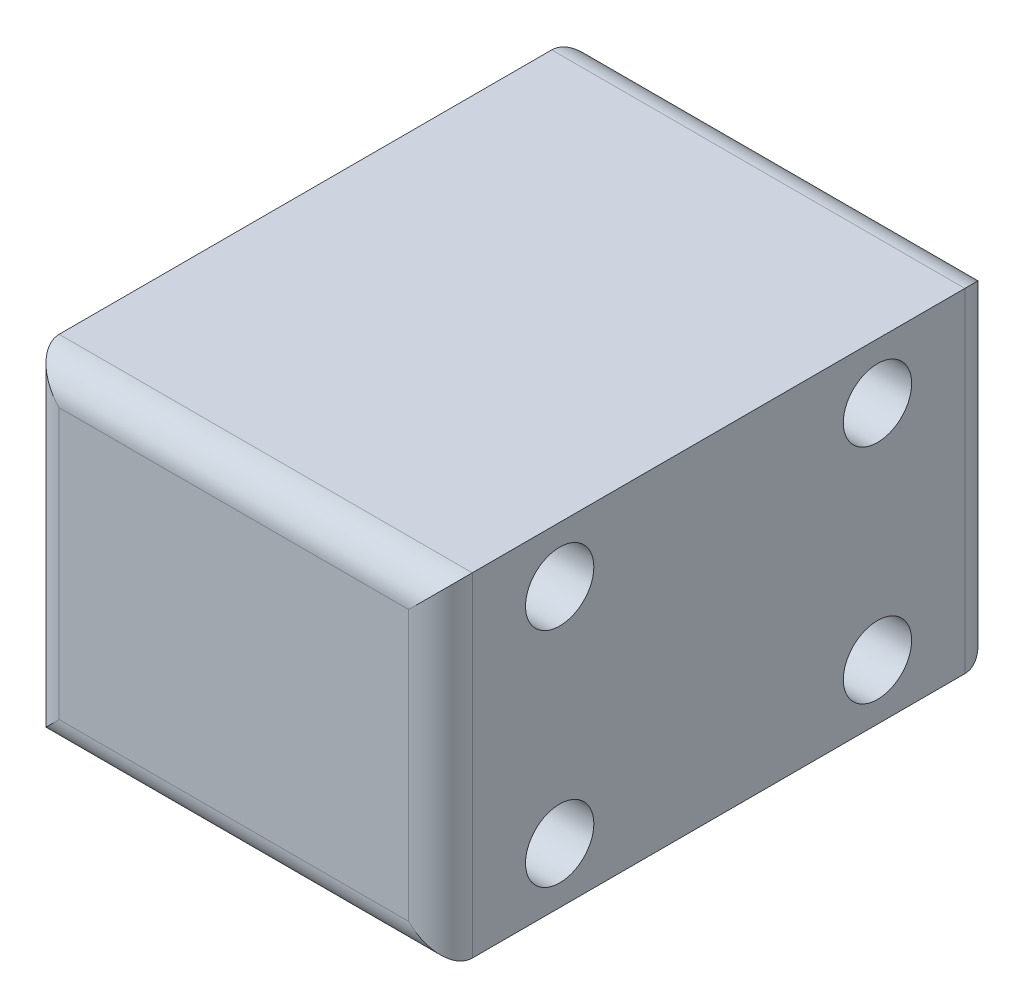
ISO-10303-21;
HEADER;
FILE_DESCRIPTION(('STEP AP214'),'2;1');
FILE_NAME('part.step','',(''),(''),'','','');
FILE_SCHEMA(('AUTOMOTIVE_DESIGN { 1 0 10303 214 1 1 1 1 }'));
ENDSEC;
DATA;
#1=APPLICATION_CONTEXT('core data for automotive mechanical design processes');
#2=APPLICATION_PROTOCOL_DEFINITION('international standard','automotive_design',2000,#1);
#3=PRODUCT_CONTEXT('',#1,'mechanical');
#4=PRODUCT('Part','Part','',(#3));
#5=PRODUCT_RELATED_PRODUCT_CATEGORY('part','',(#4));
#6=PRODUCT_DEFINITION_FORMATION('','',#4);
#7=PRODUCT_DEFINITION_CONTEXT('part definition',#1,'design');
#8=PRODUCT_DEFINITION('design','',#6,#7);
#9=PRODUCT_DEFINITION_SHAPE('','',#8);
#10=(LENGTH_UNIT() NAMED_UNIT(*) SI_UNIT(.MILLI.,.METRE.));
#11=(NAMED_UNIT(*) PLANE_ANGLE_UNIT() SI_UNIT($,.RADIAN.));
#12=(NAMED_UNIT(*) SI_UNIT($,.STERADIAN.) SOLID_ANGLE_UNIT());
#13=UNCERTAINTY_MEASURE_WITH_UNIT(LENGTH_MEASURE(1.E-05),#10,'distance_accuracy_value','');
#14=(GEOMETRIC_REPRESENTATION_CONTEXT(3) GLOBAL_UNCERTAINTY_ASSIGNED_CONTEXT((#13)) GLOBAL_UNIT_ASSIGNED_CONTEXT((#10,
#11,#12)) REPRESENTATION_CONTEXT('',''));
#15=CARTESIAN_POINT('',(0.,0.,0.));
#16=DIRECTION('',(0.,0.,1.));
#17=DIRECTION('',(1.,0.,0.));
#18=AXIS2_PLACEMENT_3D('',#15,#16,#17);
#19=CARTESIAN_POINT('',(0.,0.,35.));
#20=DIRECTION('',(-1.,0.,0.));
#21=DIRECTION('',(0.,0.,1.));
#22=AXIS2_PLACEMENT_3D('',#19,#20,#21);
#23=PLANE('',#22);
#24=CARTESIAN_POINT('',(0.,3.5,27.5));
#25=DIRECTION('',(1.,0.,0.));
#26=DIRECTION('',(0.,0.,1.));
#27=AXIS2_PLACEMENT_3D('',#24,#25,#26);
#28=CIRCLE('',#27,2.15);
#29=CARTESIAN_POINT('',(0.,3.5,29.65));
#30=VERTEX_POINT('',#29);
#31=EDGE_CURVE('E188',#30,#30,#28,.T.);
#32=ORIENTED_EDGE('',*,*,#31,.F.);
#33=EDGE_LOOP('',(#32));
#34=FACE_BOUND('',#33,.T.);
#35=CARTESIAN_POINT('',(0.,17.5,7.5));
#36=DIRECTION('',(1.,0.,0.));
#37=DIRECTION('',(0.,0.,1.));
#38=AXIS2_PLACEMENT_3D('',#35,#36,#37);
#39=CIRCLE('',#38,2.15);
#40=CARTESIAN_POINT('',(0.,17.5,9.65));
#41=VERTEX_POINT('',#40);
#42=EDGE_CURVE('E189',#41,#41,#39,.T.);
#43=ORIENTED_EDGE('',*,*,#42,.F.);
#44=EDGE_LOOP('',(#43));
#45=FACE_BOUND('',#44,.T.);
#46=CARTESIAN_POINT('',(0.,3.5,7.5));
#47=DIRECTION('',(1.,0.,0.));
#48=DIRECTION('',(0.,0.,-1.));
#49=AXIS2_PLACEMENT_3D('',#46,#47,#48);
#50=CIRCLE('',#49,2.15);
#51=CARTESIAN_POINT('',(0.,3.5,5.35));
#52=VERTEX_POINT('',#51);
#53=EDGE_CURVE('E196',#52,#52,#50,.T.);
#54=ORIENTED_EDGE('',*,*,#53,.F.);
#55=EDGE_LOOP('',(#54));
#56=FACE_BOUND('',#55,.T.);
#57=CARTESIAN_POINT('',(0.,17.5,27.5));
#58=DIRECTION('',(1.,0.,0.));
#59=DIRECTION('',(0.,0.,-1.));
#60=AXIS2_PLACEMENT_3D('',#57,#58,#59);
#61=CIRCLE('',#60,2.15);
#62=CARTESIAN_POINT('',(0.,17.5,25.35));
#63=VERTEX_POINT('',#62);
#64=EDGE_CURVE('E185',#63,#63,#61,.T.);
#65=ORIENTED_EDGE('',*,*,#64,.F.);
#66=EDGE_LOOP('',(#65));
#67=FACE_BOUND('',#66,.T.);
#68=DIRECTION('',(0.,0.,-1.));
#69=VECTOR('',#68,1.);
#70=CARTESIAN_POINT('',(0.,0.,35.));
#71=LINE('',#70,#69);
#72=CARTESIAN_POINT('',(0.,0.,33.));
#73=VERTEX_POINT('',#72);
#74=CARTESIAN_POINT('',(0.,0.,2.));
#75=VERTEX_POINT('',#74);
#76=EDGE_CURVE('E179',#73,#75,#71,.T.);
#77=ORIENTED_EDGE('',*,*,#76,.T.);
#78=DIRECTION('',(0.,1.,0.));
#79=VECTOR('',#78,1.);
#80=CARTESIAN_POINT('',(0.,0.,2.));
#81=LINE('',#80,#79);
#82=CARTESIAN_POINT('',(0.,21.,2.));
#83=VERTEX_POINT('',#82);
#84=EDGE_CURVE('E159',#75,#83,#81,.T.);
#85=ORIENTED_EDGE('',*,*,#84,.T.);
#86=DIRECTION('',(0.,0.,-1.));
#87=VECTOR('',#86,1.);
#88=CARTESIAN_POINT('',(0.,21.,35.));
#89=LINE('',#88,#87);
#90=CARTESIAN_POINT('',(0.,21.,33.));
#91=VERTEX_POINT('',#90);
#92=EDGE_CURVE('E128',#91,#83,#89,.T.);
#93=ORIENTED_EDGE('',*,*,#92,.F.);
#94=DIRECTION('',(0.,1.,0.));
#95=VECTOR('',#94,1.);
#96=CARTESIAN_POINT('',(0.,0.,33.));
#97=LINE('',#96,#95);
#98=EDGE_CURVE('E161',#91,#73,#97,.F.);
#99=ORIENTED_EDGE('',*,*,#98,.T.);
#100=EDGE_LOOP('',(#77,#85,#93,#99));
#101=FACE_BOUND('',#100,.T.);
#102=ADVANCED_FACE('F41',(#34,#45,#56,#67,#101),#23,.F.);
#103=CARTESIAN_POINT('',(0.,21.,35.));
#104=DIRECTION('',(0.,-1.,0.));
#105=DIRECTION('',(1.,0.,0.));
#106=AXIS2_PLACEMENT_3D('',#103,#104,#105);
#107=PLANE('',#106);
#108=ORIENTED_EDGE('',*,*,#92,.T.);
#109=DIRECTION('',(-1.,0.,0.));
#110=VECTOR('',#109,1.);
#111=CARTESIAN_POINT('',(0.,21.,2.));
#112=LINE('',#111,#110);
#113=CARTESIAN_POINT('',(-26.,21.,2.));
#114=VERTEX_POINT('',#113);
#115=EDGE_CURVE('E127',#83,#114,#112,.T.);
#116=ORIENTED_EDGE('',*,*,#115,.T.);
#117=DIRECTION('',(0.,0.,-1.));
#118=VECTOR('',#117,1.);
#119=CARTESIAN_POINT('',(-26.,21.,35.));
#120=LINE('',#119,#118);
#121=CARTESIAN_POINT('',(-26.,21.,33.));
#122=VERTEX_POINT('',#121);
#123=EDGE_CURVE('E110',#122,#114,#120,.T.);
#124=ORIENTED_EDGE('',*,*,#123,.F.);
#125=DIRECTION('',(-1.,0.,0.));
#126=VECTOR('',#125,1.);
#127=CARTESIAN_POINT('',(0.,21.,33.));
#128=LINE('',#127,#126);
#129=EDGE_CURVE('E124',#122,#91,#128,.F.);
#130=ORIENTED_EDGE('',*,*,#129,.T.);
#131=EDGE_LOOP('',(#108,#116,#124,#130));
#132=FACE_BOUND('',#131,.T.);
#133=ADVANCED_FACE('F123',(#132),#107,.F.);
#134=CARTESIAN_POINT('',(-26.,0.,35.));
#135=DIRECTION('',(1.,0.,0.));
#136=DIRECTION('',(0.,0.,-1.));
#137=AXIS2_PLACEMENT_3D('',#134,#135,#136);
#138=PLANE('',#137);
#139=CARTESIAN_POINT('',(-26.,3.5,27.5));
#140=DIRECTION('',(1.,0.,0.));
#141=DIRECTION('',(0.,0.,-1.));
#142=AXIS2_PLACEMENT_3D('',#139,#140,#141);
#143=CIRCLE('',#142,2.15);
#144=CARTESIAN_POINT('',(-26.,3.5,25.35));
#145=VERTEX_POINT('',#144);
#146=EDGE_CURVE('E192',#145,#145,#143,.F.);
#147=ORIENTED_EDGE('',*,*,#146,.F.);
#148=EDGE_LOOP('',(#147));
#149=FACE_BOUND('',#148,.T.);
#150=CARTESIAN_POINT('',(-26.,17.5,7.5));
#151=DIRECTION('',(1.,0.,0.));
#152=DIRECTION('',(0.,0.,-1.));
#153=AXIS2_PLACEMENT_3D('',#150,#151,#152);
#154=CIRCLE('',#153,2.15);
#155=CARTESIAN_POINT('',(-26.,17.5,5.35));
#156=VERTEX_POINT('',#155);
#157=EDGE_CURVE('E193',#156,#156,#154,.F.);
#158=ORIENTED_EDGE('',*,*,#157,.F.);
#159=EDGE_LOOP('',(#158));
#160=FACE_BOUND('',#159,.T.);
#161=CARTESIAN_POINT('',(-26.,3.5,7.5));
#162=DIRECTION('',(1.,0.,0.));
#163=DIRECTION('',(0.,0.,-1.));
#164=AXIS2_PLACEMENT_3D('',#161,#162,#163);
#165=CIRCLE('',#164,2.15);
#166=CARTESIAN_POINT('',(-26.,3.5,5.35));
#167=VERTEX_POINT('',#166);
#168=EDGE_CURVE('E150',#167,#167,#165,.F.);
#169=ORIENTED_EDGE('',*,*,#168,.F.);
#170=EDGE_LOOP('',(#169));
#171=FACE_BOUND('',#170,.T.);
#172=CARTESIAN_POINT('',(-26.,17.5,27.5));
#173=DIRECTION('',(1.,0.,0.));
#174=DIRECTION('',(0.,0.,-1.));
#175=AXIS2_PLACEMENT_3D('',#172,#173,#174);
#176=CIRCLE('',#175,2.15);
#177=CARTESIAN_POINT('',(-26.,17.5,25.35));
#178=VERTEX_POINT('',#177);
#179=EDGE_CURVE('E182',#178,#178,#176,.F.);
#180=ORIENTED_EDGE('',*,*,#179,.F.);
#181=EDGE_LOOP('',(#180));
#182=FACE_BOUND('',#181,.T.);
#183=ORIENTED_EDGE('',*,*,#123,.T.);
#184=DIRECTION('',(0.,-1.,0.));
#185=VECTOR('',#184,1.);
#186=CARTESIAN_POINT('',(-26.,0.,2.));
#187=LINE('',#186,#185);
#188=CARTESIAN_POINT('',(-26.,0.,2.));
#189=VERTEX_POINT('',#188);
#190=EDGE_CURVE('E116',#114,#189,#187,.T.);
#191=ORIENTED_EDGE('',*,*,#190,.T.);
#192=DIRECTION('',(0.,0.,-1.));
#193=VECTOR('',#192,1.);
#194=CARTESIAN_POINT('',(-26.,0.,35.));
#195=LINE('',#194,#193);
#196=CARTESIAN_POINT('',(-26.,0.,33.));
#197=VERTEX_POINT('',#196);
#198=EDGE_CURVE('E112',#197,#189,#195,.T.);
#199=ORIENTED_EDGE('',*,*,#198,.F.);
#200=DIRECTION('',(0.,-1.,0.));
#201=VECTOR('',#200,1.);
#202=CARTESIAN_POINT('',(-26.,21.,33.));
#203=LINE('',#202,#201);
#204=EDGE_CURVE('E107',#197,#122,#203,.F.);
#205=ORIENTED_EDGE('',*,*,#204,.T.);
#206=EDGE_LOOP('',(#183,#191,#199,#205));
#207=FACE_BOUND('',#206,.T.);
#208=ADVANCED_FACE('F109',(#149,#160,#171,#182,#207),#138,.F.);
#209=CARTESIAN_POINT('',(0.,0.,35.));
#210=DIRECTION('',(0.,1.,0.));
#211=DIRECTION('',(-1.,0.,0.));
#212=AXIS2_PLACEMENT_3D('',#209,#210,#211);
#213=PLANE('',#212);
#214=ORIENTED_EDGE('',*,*,#198,.T.);
#215=DIRECTION('',(1.,0.,0.));
#216=VECTOR('',#215,1.);
#217=CARTESIAN_POINT('',(0.,0.,2.));
#218=LINE('',#217,#216);
#219=EDGE_CURVE('E163',#189,#75,#218,.T.);
#220=ORIENTED_EDGE('',*,*,#219,.T.);
#221=ORIENTED_EDGE('',*,*,#76,.F.);
#222=DIRECTION('',(1.,0.,0.));
#223=VECTOR('',#222,1.);
#224=CARTESIAN_POINT('',(-26.,0.,33.));
#225=LINE('',#224,#223);
#226=EDGE_CURVE('E165',#73,#197,#225,.F.);
#227=ORIENTED_EDGE('',*,*,#226,.T.);
#228=EDGE_LOOP('',(#214,#220,#221,#227));
#229=FACE_BOUND('',#228,.T.);
#230=ADVANCED_FACE('F210',(#229),#213,.F.);
#231=CARTESIAN_POINT('',(0.,0.,35.));
#232=DIRECTION('',(0.,0.,1.));
#233=DIRECTION('',(1.,0.,0.));
#234=AXIS2_PLACEMENT_3D('',#231,#232,#233);
#235=PLANE('',#234);
#236=DIRECTION('',(0.,-1.,0.));
#237=VECTOR('',#236,1.);
#238=CARTESIAN_POINT('',(-24.,0.,35.));
#239=LINE('',#238,#237);
#240=CARTESIAN_POINT('',(-24.,19.,35.));
#241=VERTEX_POINT('',#240);
#242=CARTESIAN_POINT('',(-24.,2.,35.));
#243=VERTEX_POINT('',#242);
#244=EDGE_CURVE('E50',#241,#243,#239,.T.);
#245=ORIENTED_EDGE('',*,*,#244,.T.);
#246=DIRECTION('',(1.,0.,0.));
#247=VECTOR('',#246,1.);
#248=CARTESIAN_POINT('',(0.,2.,35.));
#249=LINE('',#248,#247);
#250=CARTESIAN_POINT('',(-2.,2.,35.));
#251=VERTEX_POINT('',#250);
#252=EDGE_CURVE('E11',#243,#251,#249,.T.);
#253=ORIENTED_EDGE('',*,*,#252,.T.);
#254=DIRECTION('',(0.,1.,0.));
#255=VECTOR('',#254,1.);
#256=CARTESIAN_POINT('',(-2.,21.,35.));
#257=LINE('',#256,#255);
#258=CARTESIAN_POINT('',(-2.,19.,35.));
#259=VERTEX_POINT('',#258);
#260=EDGE_CURVE('E157',#251,#259,#257,.T.);
#261=ORIENTED_EDGE('',*,*,#260,.T.);
#262=DIRECTION('',(-1.,0.,0.));
#263=VECTOR('',#262,1.);
#264=CARTESIAN_POINT('',(-26.,19.,35.));
#265=LINE('',#264,#263);
#266=EDGE_CURVE('E61',#259,#241,#265,.T.);
#267=ORIENTED_EDGE('',*,*,#266,.T.);
#268=EDGE_LOOP('',(#245,#253,#261,#267));
#269=FACE_BOUND('',#268,.T.);
#270=ADVANCED_FACE('F227',(#269),#235,.T.);
#271=CARTESIAN_POINT('',(0.,0.,0.));
#272=DIRECTION('',(0.,0.,1.));
#273=DIRECTION('',(1.,0.,0.));
#274=AXIS2_PLACEMENT_3D('',#271,#272,#273);
#275=PLANE('',#274);
#276=DIRECTION('',(0.,-1.,0.));
#277=VECTOR('',#276,1.);
#278=CARTESIAN_POINT('',(-24.,0.,0.));
#279=LINE('',#278,#277);
#280=CARTESIAN_POINT('',(-24.,2.,0.));
#281=VERTEX_POINT('',#280);
#282=CARTESIAN_POINT('',(-24.,19.,0.));
#283=VERTEX_POINT('',#282);
#284=EDGE_CURVE('E170',#281,#283,#279,.F.);
#285=ORIENTED_EDGE('',*,*,#284,.T.);
#286=DIRECTION('',(-1.,0.,0.));
#287=VECTOR('',#286,1.);
#288=CARTESIAN_POINT('',(0.,19.,0.));
#289=LINE('',#288,#287);
#290=CARTESIAN_POINT('',(-2.,19.,0.));
#291=VERTEX_POINT('',#290);
#292=EDGE_CURVE('E117',#283,#291,#289,.F.);
#293=ORIENTED_EDGE('',*,*,#292,.T.);
#294=DIRECTION('',(0.,1.,0.));
#295=VECTOR('',#294,1.);
#296=CARTESIAN_POINT('',(-2.,0.,0.));
#297=LINE('',#296,#295);
#298=CARTESIAN_POINT('',(-2.,2.,0.));
#299=VERTEX_POINT('',#298);
#300=EDGE_CURVE('E174',#291,#299,#297,.F.);
#301=ORIENTED_EDGE('',*,*,#300,.T.);
#302=DIRECTION('',(1.,0.,0.));
#303=VECTOR('',#302,1.);
#304=CARTESIAN_POINT('',(0.,2.,0.));
#305=LINE('',#304,#303);
#306=EDGE_CURVE('E172',#299,#281,#305,.F.);
#307=ORIENTED_EDGE('',*,*,#306,.T.);
#308=EDGE_LOOP('',(#285,#293,#301,#307));
#309=FACE_BOUND('',#308,.T.);
#310=ADVANCED_FACE('F217',(#309),#275,.F.);
#311=CARTESIAN_POINT('',(-26.001,17.5,27.5));
#312=DIRECTION('',(1.,0.,0.));
#313=DIRECTION('',(0.,0.,-1.));
#314=AXIS2_PLACEMENT_3D('',#311,#312,#313);
#315=CYLINDRICAL_SURFACE('',#314,2.15);
#316=ORIENTED_EDGE('',*,*,#64,.T.);
#317=EDGE_LOOP('',(#316));
#318=FACE_BOUND('',#317,.T.);
#319=ORIENTED_EDGE('',*,*,#179,.T.);
#320=EDGE_LOOP('',(#319));
#321=FACE_BOUND('',#320,.T.);
#322=ADVANCED_FACE('F215',(#318,#321),#315,.F.);
#323=CARTESIAN_POINT('',(-26.001,3.5,7.5));
#324=DIRECTION('',(1.,0.,0.));
#325=DIRECTION('',(0.,0.,-1.));
#326=AXIS2_PLACEMENT_3D('',#323,#324,#325);
#327=CYLINDRICAL_SURFACE('',#326,2.15);
#328=ORIENTED_EDGE('',*,*,#53,.T.);
#329=EDGE_LOOP('',(#328));
#330=FACE_BOUND('',#329,.T.);
#331=ORIENTED_EDGE('',*,*,#168,.T.);
#332=EDGE_LOOP('',(#331));
#333=FACE_BOUND('',#332,.T.);
#334=ADVANCED_FACE('F206',(#330,#333),#327,.F.);
#335=CARTESIAN_POINT('',(-26.001,17.5,7.5));
#336=DIRECTION('',(1.,0.,0.));
#337=DIRECTION('',(0.,0.,-1.));
#338=AXIS2_PLACEMENT_3D('',#335,#336,#337);
#339=CYLINDRICAL_SURFACE('',#338,2.15);
#340=ORIENTED_EDGE('',*,*,#42,.T.);
#341=EDGE_LOOP('',(#340));
#342=FACE_BOUND('',#341,.T.);
#343=ORIENTED_EDGE('',*,*,#157,.T.);
#344=EDGE_LOOP('',(#343));
#345=FACE_BOUND('',#344,.T.);
#346=ADVANCED_FACE('F223',(#342,#345),#339,.F.);
#347=CARTESIAN_POINT('',(-26.001,3.5,27.5));
#348=DIRECTION('',(1.,0.,0.));
#349=DIRECTION('',(0.,0.,-1.));
#350=AXIS2_PLACEMENT_3D('',#347,#348,#349);
#351=CYLINDRICAL_SURFACE('',#350,2.15);
#352=ORIENTED_EDGE('',*,*,#31,.T.);
#353=EDGE_LOOP('',(#352));
#354=FACE_BOUND('',#353,.T.);
#355=ORIENTED_EDGE('',*,*,#146,.T.);
#356=EDGE_LOOP('',(#355));
#357=FACE_BOUND('',#356,.T.);
#358=ADVANCED_FACE('F258',(#354,#357),#351,.F.);
#359=CARTESIAN_POINT('',(0.,2.,2.));
#360=DIRECTION('',(1.,0.,0.));
#361=DIRECTION('',(0.,1.,0.));
#362=AXIS2_PLACEMENT_3D('',#359,#360,#361);
#363=CYLINDRICAL_SURFACE('',#362,2.);
#364=CARTESIAN_POINT('',(-24.,2.,2.));
#365=DIRECTION('',(0.707106781186548,-0.707106781186547,0.));
#366=DIRECTION('',(0.707106781186547,0.707106781186548,0.));
#367=AXIS2_PLACEMENT_3D('',#364,#365,#366);
#368=ELLIPSE('',#367,2.82842712474619,2.);
#369=EDGE_CURVE('E151',#281,#189,#368,.F.);
#370=ORIENTED_EDGE('',*,*,#369,.F.);
#371=ORIENTED_EDGE('',*,*,#306,.F.);
#372=CARTESIAN_POINT('',(-2.,2.,2.));
#373=DIRECTION('',(0.707106781186547,0.707106781186548,0.));
#374=DIRECTION('',(-0.707106781186548,0.707106781186547,0.));
#375=AXIS2_PLACEMENT_3D('',#372,#373,#374);
#376=ELLIPSE('',#375,2.82842712474619,2.);
#377=EDGE_CURVE('E147',#75,#299,#376,.T.);
#378=ORIENTED_EDGE('',*,*,#377,.F.);
#379=ORIENTED_EDGE('',*,*,#219,.F.);
#380=EDGE_LOOP('',(#370,#371,#378,#379));
#381=FACE_BOUND('',#380,.T.);
#382=ADVANCED_FACE('F254',(#381),#363,.T.);
#383=CARTESIAN_POINT('',(-2.,0.,2.));
#384=DIRECTION('',(0.,1.,0.));
#385=DIRECTION('',(0.,0.,1.));
#386=AXIS2_PLACEMENT_3D('',#383,#384,#385);
#387=CYLINDRICAL_SURFACE('',#386,2.);
#388=ORIENTED_EDGE('',*,*,#377,.T.);
#389=ORIENTED_EDGE('',*,*,#300,.F.);
#390=CARTESIAN_POINT('',(-2.,19.,2.));
#391=DIRECTION('',(-0.707106781186548,0.707106781186547,0.));
#392=DIRECTION('',(0.707106781186547,0.707106781186548,0.));
#393=AXIS2_PLACEMENT_3D('',#390,#391,#392);
#394=ELLIPSE('',#393,2.82842712474619,2.);
#395=EDGE_CURVE('E138',#83,#291,#394,.T.);
#396=ORIENTED_EDGE('',*,*,#395,.F.);
#397=ORIENTED_EDGE('',*,*,#84,.F.);
#398=EDGE_LOOP('',(#388,#389,#396,#397));
#399=FACE_BOUND('',#398,.T.);
#400=ADVANCED_FACE('F250',(#399),#387,.T.);
#401=CARTESIAN_POINT('',(-24.,0.,2.));
#402=DIRECTION('',(0.,-1.,0.));
#403=DIRECTION('',(0.,0.,-1.));
#404=AXIS2_PLACEMENT_3D('',#401,#402,#403);
#405=CYLINDRICAL_SURFACE('',#404,2.);
#406=ORIENTED_EDGE('',*,*,#369,.T.);
#407=ORIENTED_EDGE('',*,*,#190,.F.);
#408=CARTESIAN_POINT('',(-24.,19.,2.));
#409=DIRECTION('',(-0.707106781186547,-0.707106781186548,0.));
#410=DIRECTION('',(0.707106781186548,-0.707106781186547,0.));
#411=AXIS2_PLACEMENT_3D('',#408,#409,#410);
#412=ELLIPSE('',#411,2.82842712474619,2.);
#413=EDGE_CURVE('E137',#283,#114,#412,.F.);
#414=ORIENTED_EDGE('',*,*,#413,.F.);
#415=ORIENTED_EDGE('',*,*,#284,.F.);
#416=EDGE_LOOP('',(#406,#407,#414,#415));
#417=FACE_BOUND('',#416,.T.);
#418=ADVANCED_FACE('F246',(#417),#405,.T.);
#419=CARTESIAN_POINT('',(0.,19.,2.));
#420=DIRECTION('',(-1.,0.,0.));
#421=DIRECTION('',(0.,-1.,0.));
#422=AXIS2_PLACEMENT_3D('',#419,#420,#421);
#423=CYLINDRICAL_SURFACE('',#422,2.);
#424=ORIENTED_EDGE('',*,*,#395,.T.);
#425=ORIENTED_EDGE('',*,*,#292,.F.);
#426=ORIENTED_EDGE('',*,*,#413,.T.);
#427=ORIENTED_EDGE('',*,*,#115,.F.);
#428=EDGE_LOOP('',(#424,#425,#426,#427));
#429=FACE_BOUND('',#428,.T.);
#430=ADVANCED_FACE('F243',(#429),#423,.T.);
#431=CARTESIAN_POINT('',(0.,19.,33.));
#432=DIRECTION('',(1.,0.,0.));
#433=DIRECTION('',(0.,1.,0.));
#434=AXIS2_PLACEMENT_3D('',#431,#432,#433);
#435=CYLINDRICAL_SURFACE('',#434,2.);
#436=CARTESIAN_POINT('',(-2.,19.,33.));
#437=DIRECTION('',(0.707106781186548,-0.707106781186547,0.));
#438=DIRECTION('',(-0.707106781186547,-0.707106781186548,0.));
#439=AXIS2_PLACEMENT_3D('',#436,#437,#438);
#440=ELLIPSE('',#439,2.82842712474619,2.);
#441=EDGE_CURVE('E133',#91,#259,#440,.T.);
#442=ORIENTED_EDGE('',*,*,#441,.F.);
#443=ORIENTED_EDGE('',*,*,#129,.F.);
#444=CARTESIAN_POINT('',(-24.,19.,33.));
#445=DIRECTION('',(0.707106781186547,0.707106781186548,0.));
#446=DIRECTION('',(0.707106781186548,-0.707106781186547,0.));
#447=AXIS2_PLACEMENT_3D('',#444,#445,#446);
#448=ELLIPSE('',#447,2.82842712474619,2.);
#449=EDGE_CURVE('E45',#241,#122,#448,.F.);
#450=ORIENTED_EDGE('',*,*,#449,.F.);
#451=ORIENTED_EDGE('',*,*,#266,.F.);
#452=EDGE_LOOP('',(#442,#443,#450,#451));
#453=FACE_BOUND('',#452,.T.);
#454=ADVANCED_FACE('F43',(#453),#435,.T.);
#455=CARTESIAN_POINT('',(-24.,0.,33.));
#456=DIRECTION('',(0.,1.,0.));
#457=DIRECTION('',(0.,0.,1.));
#458=AXIS2_PLACEMENT_3D('',#455,#456,#457);
#459=CYLINDRICAL_SURFACE('',#458,2.);
#460=ORIENTED_EDGE('',*,*,#449,.T.);
#461=ORIENTED_EDGE('',*,*,#204,.F.);
#462=CARTESIAN_POINT('',(-24.,2.,33.));
#463=DIRECTION('',(-0.707106781186548,0.707106781186547,0.));
#464=DIRECTION('',(0.707106781186547,0.707106781186548,0.));
#465=AXIS2_PLACEMENT_3D('',#462,#463,#464);
#466=ELLIPSE('',#465,2.82842712474619,2.);
#467=EDGE_CURVE('E140',#243,#197,#466,.F.);
#468=ORIENTED_EDGE('',*,*,#467,.F.);
#469=ORIENTED_EDGE('',*,*,#244,.F.);
#470=EDGE_LOOP('',(#460,#461,#468,#469));
#471=FACE_BOUND('',#470,.T.);
#472=ADVANCED_FACE('F136',(#471),#459,.T.);
#473=CARTESIAN_POINT('',(-2.,0.,33.));
#474=DIRECTION('',(0.,-1.,0.));
#475=DIRECTION('',(0.,0.,-1.));
#476=AXIS2_PLACEMENT_3D('',#473,#474,#475);
#477=CYLINDRICAL_SURFACE('',#476,2.);
#478=ORIENTED_EDGE('',*,*,#441,.T.);
#479=ORIENTED_EDGE('',*,*,#260,.F.);
#480=CARTESIAN_POINT('',(-2.,2.,33.));
#481=DIRECTION('',(-0.707106781186547,-0.707106781186548,0.));
#482=DIRECTION('',(0.707106781186548,-0.707106781186547,0.));
#483=AXIS2_PLACEMENT_3D('',#480,#481,#482);
#484=ELLIPSE('',#483,2.82842712474619,2.);
#485=EDGE_CURVE('E143',#73,#251,#484,.T.);
#486=ORIENTED_EDGE('',*,*,#485,.F.);
#487=ORIENTED_EDGE('',*,*,#98,.F.);
#488=EDGE_LOOP('',(#478,#479,#486,#487));
#489=FACE_BOUND('',#488,.T.);
#490=ADVANCED_FACE('F263',(#489),#477,.T.);
#491=CARTESIAN_POINT('',(0.,2.,33.));
#492=DIRECTION('',(-1.,0.,0.));
#493=DIRECTION('',(0.,-1.,0.));
#494=AXIS2_PLACEMENT_3D('',#491,#492,#493);
#495=CYLINDRICAL_SURFACE('',#494,2.);
#496=ORIENTED_EDGE('',*,*,#467,.T.);
#497=ORIENTED_EDGE('',*,*,#226,.F.);
#498=ORIENTED_EDGE('',*,*,#485,.T.);
#499=ORIENTED_EDGE('',*,*,#252,.F.);
#500=EDGE_LOOP('',(#496,#497,#498,#499));
#501=FACE_BOUND('',#500,.T.);
#502=ADVANCED_FACE('F260',(#501),#495,.T.);
#503=CLOSED_SHELL('',(#102,#133,#208,#230,#270,#310,#322,#334,#346,#358,#382,#400,#418,#430,
#454,#472,#490,#502));
#504=MANIFOLD_SOLID_BREP('B2',#503);
#505=ADVANCED_BREP_SHAPE_REPRESENTATION('',(#18,#504),#14);
#506=SHAPE_DEFINITION_REPRESENTATION(#9,#505);
ENDSEC;
END-ISO-10303-21;
